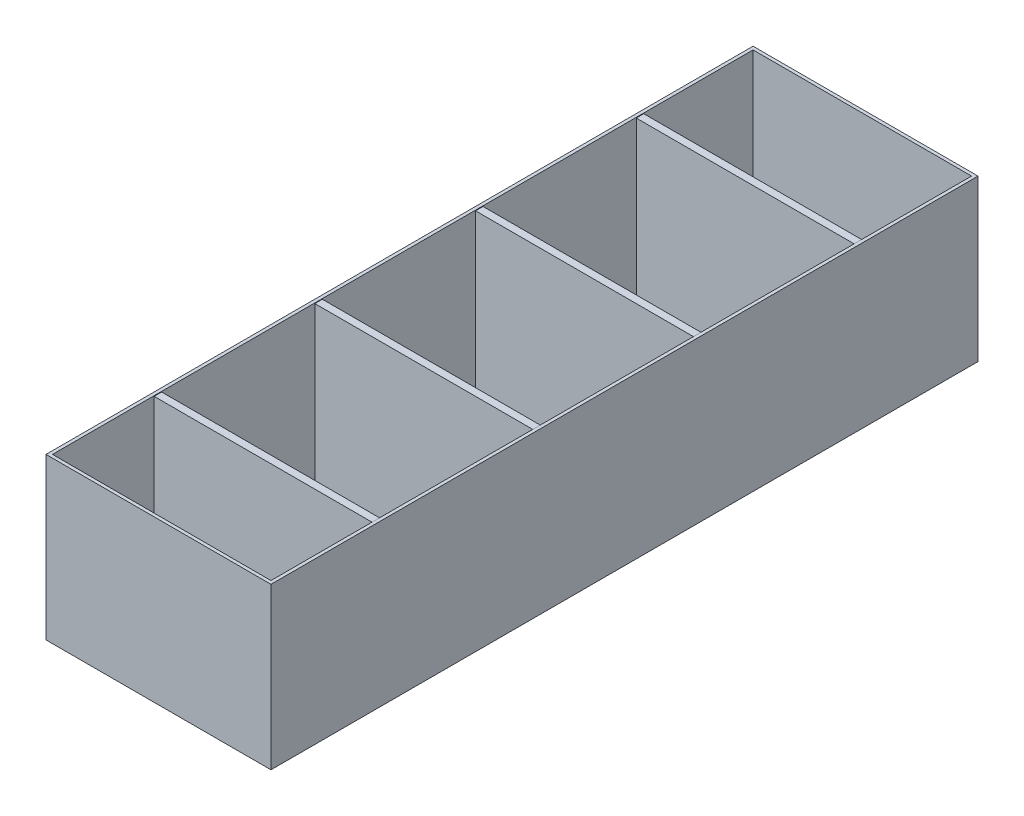
ISO-10303-21;
HEADER;
FILE_DESCRIPTION(('STEP AP214'),'2;1');
FILE_NAME('part.step','',(''),(''),'','','');
FILE_SCHEMA(('AUTOMOTIVE_DESIGN { 1 0 10303 214 1 1 1 1 }'));
ENDSEC;
DATA;
#1=APPLICATION_CONTEXT('core data for automotive mechanical design processes');
#2=APPLICATION_PROTOCOL_DEFINITION('international standard','automotive_design',2000,#1);
#3=PRODUCT_CONTEXT('',#1,'mechanical');
#4=PRODUCT('Part','Part','',(#3));
#5=PRODUCT_RELATED_PRODUCT_CATEGORY('part','',(#4));
#6=PRODUCT_DEFINITION_FORMATION('','',#4);
#7=PRODUCT_DEFINITION_CONTEXT('part definition',#1,'design');
#8=PRODUCT_DEFINITION('design','',#6,#7);
#9=PRODUCT_DEFINITION_SHAPE('','',#8);
#10=(LENGTH_UNIT() NAMED_UNIT(*) SI_UNIT(.MILLI.,.METRE.));
#11=(NAMED_UNIT(*) PLANE_ANGLE_UNIT() SI_UNIT($,.RADIAN.));
#12=(NAMED_UNIT(*) SI_UNIT($,.STERADIAN.) SOLID_ANGLE_UNIT());
#13=UNCERTAINTY_MEASURE_WITH_UNIT(LENGTH_MEASURE(1.E-05),#10,'distance_accuracy_value','');
#14=(GEOMETRIC_REPRESENTATION_CONTEXT(3) GLOBAL_UNCERTAINTY_ASSIGNED_CONTEXT((#13)) GLOBAL_UNIT_ASSIGNED_CONTEXT((#10,
#11,#12)) REPRESENTATION_CONTEXT('',''));
#15=CARTESIAN_POINT('',(0.,0.,0.));
#16=DIRECTION('',(0.,0.,1.));
#17=DIRECTION('',(1.,0.,0.));
#18=AXIS2_PLACEMENT_3D('',#15,#16,#17);
#19=CARTESIAN_POINT('',(340.,250.,2200.));
#20=DIRECTION('',(-1.,0.,0.));
#21=DIRECTION('',(0.,-1.,0.));
#22=AXIS2_PLACEMENT_3D('',#19,#20,#21);
#23=PLANE('',#22);
#24=DIRECTION('',(0.,0.,-1.));
#25=VECTOR('',#24,1.);
#26=CARTESIAN_POINT('',(340.,248.,1850.03303068523));
#27=LINE('',#26,#25);
#28=CARTESIAN_POINT('',(340.,248.,1873.35244173129));
#29=VERTEX_POINT('',#28);
#30=CARTESIAN_POINT('',(340.,248.,1850.03303068523));
#31=VERTEX_POINT('',#30);
#32=EDGE_CURVE('E207',#29,#31,#27,.T.);
#33=ORIENTED_EDGE('',*,*,#32,.F.);
#34=DIRECTION('',(0.,-1.,0.));
#35=VECTOR('',#34,1.);
#36=CARTESIAN_POINT('',(340.,248.,1873.35244173129));
#37=LINE('',#36,#35);
#38=CARTESIAN_POINT('',(340.,-240.,1873.35244173129));
#39=VERTEX_POINT('',#38);
#40=EDGE_CURVE('E204',#29,#39,#37,.T.);
#41=ORIENTED_EDGE('',*,*,#40,.T.);
#42=DIRECTION('',(0.,0.,-1.));
#43=VECTOR('',#42,1.);
#44=CARTESIAN_POINT('',(340.,-240.,2200.));
#45=LINE('',#44,#43);
#46=CARTESIAN_POINT('',(340.,-240.,2190.));
#47=VERTEX_POINT('',#46);
#48=EDGE_CURVE('E308',#47,#39,#45,.T.);
#49=ORIENTED_EDGE('',*,*,#48,.F.);
#50=DIRECTION('',(0.,1.,0.));
#51=VECTOR('',#50,1.);
#52=CARTESIAN_POINT('',(340.,250.,2190.));
#53=LINE('',#52,#51);
#54=CARTESIAN_POINT('',(340.,250.,2190.));
#55=VERTEX_POINT('',#54);
#56=EDGE_CURVE('E304',#47,#55,#53,.T.);
#57=ORIENTED_EDGE('',*,*,#56,.T.);
#58=DIRECTION('',(0.,0.,-1.));
#59=VECTOR('',#58,1.);
#60=CARTESIAN_POINT('',(340.,250.,2200.));
#61=LINE('',#60,#59);
#62=CARTESIAN_POINT('',(340.,250.,10.));
#63=VERTEX_POINT('',#62);
#64=EDGE_CURVE('E326',#55,#63,#61,.T.);
#65=ORIENTED_EDGE('',*,*,#64,.T.);
#66=DIRECTION('',(0.,1.,0.));
#67=VECTOR('',#66,1.);
#68=CARTESIAN_POINT('',(340.,250.,9.99999999999979));
#69=LINE('',#68,#67);
#70=CARTESIAN_POINT('',(340.,-240.,10.));
#71=VERTEX_POINT('',#70);
#72=EDGE_CURVE('E300',#71,#63,#69,.T.);
#73=ORIENTED_EDGE('',*,*,#72,.F.);
#74=CARTESIAN_POINT('',(340.,-240.,350.033030685231));
#75=VERTEX_POINT('',#74);
#76=EDGE_CURVE('E313',#75,#71,#45,.T.);
#77=ORIENTED_EDGE('',*,*,#76,.F.);
#78=DIRECTION('',(0.,-1.,0.));
#79=VECTOR('',#78,1.);
#80=CARTESIAN_POINT('',(340.,248.,350.033030685231));
#81=LINE('',#80,#79);
#82=CARTESIAN_POINT('',(340.,248.,350.033030685231));
#83=VERTEX_POINT('',#82);
#84=EDGE_CURVE('E292',#83,#75,#81,.T.);
#85=ORIENTED_EDGE('',*,*,#84,.F.);
#86=DIRECTION('',(0.,0.,-1.));
#87=VECTOR('',#86,1.);
#88=CARTESIAN_POINT('',(340.,248.,350.033030685231));
#89=LINE('',#88,#87);
#90=CARTESIAN_POINT('',(340.,248.,373.352441731289));
#91=VERTEX_POINT('',#90);
#92=EDGE_CURVE('E282',#91,#83,#89,.T.);
#93=ORIENTED_EDGE('',*,*,#92,.F.);
#94=DIRECTION('',(0.,-1.,0.));
#95=VECTOR('',#94,1.);
#96=CARTESIAN_POINT('',(340.,248.,373.352441731289));
#97=LINE('',#96,#95);
#98=CARTESIAN_POINT('',(340.,-240.,373.352441731289));
#99=VERTEX_POINT('',#98);
#100=EDGE_CURVE('E294',#91,#99,#97,.T.);
#101=ORIENTED_EDGE('',*,*,#100,.T.);
#102=CARTESIAN_POINT('',(340.,-240.,850.033030685231));
#103=VERTEX_POINT('',#102);
#104=EDGE_CURVE('E413',#103,#99,#45,.T.);
#105=ORIENTED_EDGE('',*,*,#104,.F.);
#106=DIRECTION('',(0.,-1.,0.));
#107=VECTOR('',#106,1.);
#108=CARTESIAN_POINT('',(340.,248.,850.033030685231));
#109=LINE('',#108,#107);
#110=CARTESIAN_POINT('',(340.,248.,850.033030685231));
#111=VERTEX_POINT('',#110);
#112=EDGE_CURVE('E267',#111,#103,#109,.T.);
#113=ORIENTED_EDGE('',*,*,#112,.F.);
#114=DIRECTION('',(0.,0.,-1.));
#115=VECTOR('',#114,1.);
#116=CARTESIAN_POINT('',(340.,248.,850.033030685231));
#117=LINE('',#116,#115);
#118=CARTESIAN_POINT('',(340.,248.,873.352441731289));
#119=VERTEX_POINT('',#118);
#120=EDGE_CURVE('E257',#119,#111,#117,.T.);
#121=ORIENTED_EDGE('',*,*,#120,.F.);
#122=DIRECTION('',(0.,-1.,0.));
#123=VECTOR('',#122,1.);
#124=CARTESIAN_POINT('',(340.,248.,873.352441731289));
#125=LINE('',#124,#123);
#126=CARTESIAN_POINT('',(340.,-240.,873.352441731289));
#127=VERTEX_POINT('',#126);
#128=EDGE_CURVE('E269',#119,#127,#125,.T.);
#129=ORIENTED_EDGE('',*,*,#128,.T.);
#130=CARTESIAN_POINT('',(340.,-240.,1350.03303068523));
#131=VERTEX_POINT('',#130);
#132=EDGE_CURVE('E412',#131,#127,#45,.T.);
#133=ORIENTED_EDGE('',*,*,#132,.F.);
#134=DIRECTION('',(0.,-1.,0.));
#135=VECTOR('',#134,1.);
#136=CARTESIAN_POINT('',(340.,248.,1350.03303068523));
#137=LINE('',#136,#135);
#138=CARTESIAN_POINT('',(340.,248.,1350.03303068523));
#139=VERTEX_POINT('',#138);
#140=EDGE_CURVE('E58',#139,#131,#137,.T.);
#141=ORIENTED_EDGE('',*,*,#140,.F.);
#142=DIRECTION('',(0.,0.,-1.));
#143=VECTOR('',#142,1.);
#144=CARTESIAN_POINT('',(340.,248.,1350.03303068523));
#145=LINE('',#144,#143);
#146=CARTESIAN_POINT('',(340.,248.,1373.35244173129));
#147=VERTEX_POINT('',#146);
#148=EDGE_CURVE('E235',#147,#139,#145,.T.);
#149=ORIENTED_EDGE('',*,*,#148,.F.);
#150=DIRECTION('',(0.,-1.,0.));
#151=VECTOR('',#150,1.);
#152=CARTESIAN_POINT('',(340.,248.,1373.35244173129));
#153=LINE('',#152,#151);
#154=CARTESIAN_POINT('',(340.,-240.,1373.35244173129));
#155=VERTEX_POINT('',#154);
#156=EDGE_CURVE('E244',#147,#155,#153,.T.);
#157=ORIENTED_EDGE('',*,*,#156,.T.);
#158=CARTESIAN_POINT('',(340.,-240.,1850.03303068523));
#159=VERTEX_POINT('',#158);
#160=EDGE_CURVE('E312',#159,#155,#45,.T.);
#161=ORIENTED_EDGE('',*,*,#160,.F.);
#162=DIRECTION('',(0.,-1.,0.));
#163=VECTOR('',#162,1.);
#164=CARTESIAN_POINT('',(340.,248.,1850.03303068523));
#165=LINE('',#164,#163);
#166=EDGE_CURVE('E50',#31,#159,#165,.T.);
#167=ORIENTED_EDGE('',*,*,#166,.F.);
#168=EDGE_LOOP('',(#33,#41,#49,#57,#65,#73,#77,#85,#93,#101,#105,#113,#121,#129,#133,#141,#149,
#157,#161,#167));
#169=FACE_BOUND('',#168,.T.);
#170=ADVANCED_FACE('F35',(#169),#23,.T.);
#171=CARTESIAN_POINT('',(-340.,250.,2200.));
#172=DIRECTION('',(1.,0.,0.));
#173=DIRECTION('',(0.,1.,0.));
#174=AXIS2_PLACEMENT_3D('',#171,#172,#173);
#175=PLANE('',#174);
#176=DIRECTION('',(0.,0.,-1.));
#177=VECTOR('',#176,1.);
#178=CARTESIAN_POINT('',(-340.,-240.,2200.));
#179=LINE('',#178,#177);
#180=CARTESIAN_POINT('',(-340.,-240.,2190.));
#181=VERTEX_POINT('',#180);
#182=CARTESIAN_POINT('',(-340.,-240.,1873.35244173129));
#183=VERTEX_POINT('',#182);
#184=EDGE_CURVE('E221',#181,#183,#179,.T.);
#185=ORIENTED_EDGE('',*,*,#184,.T.);
#186=DIRECTION('',(0.,-1.,0.));
#187=VECTOR('',#186,1.);
#188=CARTESIAN_POINT('',(-340.,248.,1873.35244173129));
#189=LINE('',#188,#187);
#190=CARTESIAN_POINT('',(-340.,248.,1873.35244173129));
#191=VERTEX_POINT('',#190);
#192=EDGE_CURVE('E201',#191,#183,#189,.T.);
#193=ORIENTED_EDGE('',*,*,#192,.F.);
#194=DIRECTION('',(0.,0.,1.));
#195=VECTOR('',#194,1.);
#196=CARTESIAN_POINT('',(-340.,248.,1873.35244173129));
#197=LINE('',#196,#195);
#198=CARTESIAN_POINT('',(-340.,248.,1850.03303068523));
#199=VERTEX_POINT('',#198);
#200=EDGE_CURVE('E208',#199,#191,#197,.T.);
#201=ORIENTED_EDGE('',*,*,#200,.F.);
#202=DIRECTION('',(0.,-1.,0.));
#203=VECTOR('',#202,1.);
#204=CARTESIAN_POINT('',(-340.,248.,1850.03303068523));
#205=LINE('',#204,#203);
#206=CARTESIAN_POINT('',(-340.,-240.,1850.03303068523));
#207=VERTEX_POINT('',#206);
#208=EDGE_CURVE('E403',#199,#207,#205,.T.);
#209=ORIENTED_EDGE('',*,*,#208,.T.);
#210=CARTESIAN_POINT('',(-340.,-240.,1373.35244173129));
#211=VERTEX_POINT('',#210);
#212=EDGE_CURVE('E322',#207,#211,#179,.T.);
#213=ORIENTED_EDGE('',*,*,#212,.T.);
#214=DIRECTION('',(0.,-1.,0.));
#215=VECTOR('',#214,1.);
#216=CARTESIAN_POINT('',(-340.,248.,1373.35244173129));
#217=LINE('',#216,#215);
#218=CARTESIAN_POINT('',(-340.,248.,1373.35244173129));
#219=VERTEX_POINT('',#218);
#220=EDGE_CURVE('E247',#219,#211,#217,.T.);
#221=ORIENTED_EDGE('',*,*,#220,.F.);
#222=DIRECTION('',(0.,0.,1.));
#223=VECTOR('',#222,1.);
#224=CARTESIAN_POINT('',(-340.,248.,1373.35244173129));
#225=LINE('',#224,#223);
#226=CARTESIAN_POINT('',(-340.,248.,1350.03303068523));
#227=VERTEX_POINT('',#226);
#228=EDGE_CURVE('E230',#227,#219,#225,.T.);
#229=ORIENTED_EDGE('',*,*,#228,.F.);
#230=DIRECTION('',(0.,-1.,0.));
#231=VECTOR('',#230,1.);
#232=CARTESIAN_POINT('',(-340.,248.,1350.03303068523));
#233=LINE('',#232,#231);
#234=CARTESIAN_POINT('',(-340.,-240.,1350.03303068523));
#235=VERTEX_POINT('',#234);
#236=EDGE_CURVE('E238',#227,#235,#233,.T.);
#237=ORIENTED_EDGE('',*,*,#236,.T.);
#238=CARTESIAN_POINT('',(-340.,-240.,873.352441731289));
#239=VERTEX_POINT('',#238);
#240=EDGE_CURVE('E395',#235,#239,#179,.T.);
#241=ORIENTED_EDGE('',*,*,#240,.T.);
#242=DIRECTION('',(0.,-1.,0.));
#243=VECTOR('',#242,1.);
#244=CARTESIAN_POINT('',(-340.,248.,873.352441731289));
#245=LINE('',#244,#243);
#246=CARTESIAN_POINT('',(-340.,248.,873.352441731289));
#247=VERTEX_POINT('',#246);
#248=EDGE_CURVE('E272',#247,#239,#245,.T.);
#249=ORIENTED_EDGE('',*,*,#248,.F.);
#250=DIRECTION('',(0.,0.,1.));
#251=VECTOR('',#250,1.);
#252=CARTESIAN_POINT('',(-340.,248.,873.352441731289));
#253=LINE('',#252,#251);
#254=CARTESIAN_POINT('',(-340.,248.,850.033030685231));
#255=VERTEX_POINT('',#254);
#256=EDGE_CURVE('E251',#255,#247,#253,.T.);
#257=ORIENTED_EDGE('',*,*,#256,.F.);
#258=DIRECTION('',(0.,-1.,0.));
#259=VECTOR('',#258,1.);
#260=CARTESIAN_POINT('',(-340.,248.,850.033030685231));
#261=LINE('',#260,#259);
#262=CARTESIAN_POINT('',(-340.,-240.,850.033030685231));
#263=VERTEX_POINT('',#262);
#264=EDGE_CURVE('E261',#255,#263,#261,.T.);
#265=ORIENTED_EDGE('',*,*,#264,.T.);
#266=CARTESIAN_POINT('',(-340.,-240.,373.352441731289));
#267=VERTEX_POINT('',#266);
#268=EDGE_CURVE('E394',#263,#267,#179,.T.);
#269=ORIENTED_EDGE('',*,*,#268,.T.);
#270=DIRECTION('',(0.,-1.,0.));
#271=VECTOR('',#270,1.);
#272=CARTESIAN_POINT('',(-340.,248.,373.352441731289));
#273=LINE('',#272,#271);
#274=CARTESIAN_POINT('',(-340.,248.,373.352441731289));
#275=VERTEX_POINT('',#274);
#276=EDGE_CURVE('E297',#275,#267,#273,.T.);
#277=ORIENTED_EDGE('',*,*,#276,.F.);
#278=DIRECTION('',(0.,0.,1.));
#279=VECTOR('',#278,1.);
#280=CARTESIAN_POINT('',(-340.,248.,373.352441731289));
#281=LINE('',#280,#279);
#282=CARTESIAN_POINT('',(-340.,248.,350.033030685231));
#283=VERTEX_POINT('',#282);
#284=EDGE_CURVE('E276',#283,#275,#281,.T.);
#285=ORIENTED_EDGE('',*,*,#284,.F.);
#286=DIRECTION('',(0.,-1.,0.));
#287=VECTOR('',#286,1.);
#288=CARTESIAN_POINT('',(-340.,248.,350.033030685231));
#289=LINE('',#288,#287);
#290=CARTESIAN_POINT('',(-340.,-240.,350.033030685231));
#291=VERTEX_POINT('',#290);
#292=EDGE_CURVE('E286',#283,#291,#289,.T.);
#293=ORIENTED_EDGE('',*,*,#292,.T.);
#294=CARTESIAN_POINT('',(-340.,-240.,10.));
#295=VERTEX_POINT('',#294);
#296=EDGE_CURVE('E311',#291,#295,#179,.T.);
#297=ORIENTED_EDGE('',*,*,#296,.T.);
#298=DIRECTION('',(0.,-1.,0.));
#299=VECTOR('',#298,1.);
#300=CARTESIAN_POINT('',(-340.,250.,9.99999999999979));
#301=LINE('',#300,#299);
#302=CARTESIAN_POINT('',(-340.,250.,10.));
#303=VERTEX_POINT('',#302);
#304=EDGE_CURVE('E316',#303,#295,#301,.T.);
#305=ORIENTED_EDGE('',*,*,#304,.F.);
#306=DIRECTION('',(0.,0.,-1.));
#307=VECTOR('',#306,1.);
#308=CARTESIAN_POINT('',(-340.,250.,2200.));
#309=LINE('',#308,#307);
#310=CARTESIAN_POINT('',(-340.,250.,2190.));
#311=VERTEX_POINT('',#310);
#312=EDGE_CURVE('E321',#311,#303,#309,.T.);
#313=ORIENTED_EDGE('',*,*,#312,.F.);
#314=DIRECTION('',(0.,-1.,0.));
#315=VECTOR('',#314,1.);
#316=CARTESIAN_POINT('',(-340.,250.,2190.));
#317=LINE('',#316,#315);
#318=EDGE_CURVE('E319',#311,#181,#317,.T.);
#319=ORIENTED_EDGE('',*,*,#318,.T.);
#320=EDGE_LOOP('',(#185,#193,#201,#209,#213,#221,#229,#237,#241,#249,#257,#265,#269,#277,#285,
#293,#297,#305,#313,#319));
#321=FACE_BOUND('',#320,.T.);
#322=ADVANCED_FACE('F219',(#321),#175,.T.);
#323=CARTESIAN_POINT('',(-350.,-240.,2200.));
#324=DIRECTION('',(0.,1.,0.));
#325=DIRECTION('',(0.,0.,1.));
#326=AXIS2_PLACEMENT_3D('',#323,#324,#325);
#327=PLANE('',#326);
#328=ORIENTED_EDGE('',*,*,#48,.T.);
#329=DIRECTION('',(1.,0.,0.));
#330=VECTOR('',#329,1.);
#331=CARTESIAN_POINT('',(340.,-240.,1873.35244173129));
#332=LINE('',#331,#330);
#333=EDGE_CURVE('E431',#183,#39,#332,.T.);
#334=ORIENTED_EDGE('',*,*,#333,.F.);
#335=ORIENTED_EDGE('',*,*,#184,.F.);
#336=DIRECTION('',(1.,0.,0.));
#337=VECTOR('',#336,1.);
#338=CARTESIAN_POINT('',(-350.,-240.,2190.));
#339=LINE('',#338,#337);
#340=EDGE_CURVE('E317',#181,#47,#339,.T.);
#341=ORIENTED_EDGE('',*,*,#340,.T.);
#342=EDGE_LOOP('',(#328,#334,#335,#341));
#343=FACE_BOUND('',#342,.T.);
#344=ADVANCED_FACE('F430',(#343),#327,.T.);
#345=ORIENTED_EDGE('',*,*,#212,.F.);
#346=DIRECTION('',(-1.,0.,0.));
#347=VECTOR('',#346,1.);
#348=CARTESIAN_POINT('',(-340.,-240.,1850.03303068523));
#349=LINE('',#348,#347);
#350=EDGE_CURVE('E216',#159,#207,#349,.T.);
#351=ORIENTED_EDGE('',*,*,#350,.F.);
#352=ORIENTED_EDGE('',*,*,#160,.T.);
#353=DIRECTION('',(1.,0.,0.));
#354=VECTOR('',#353,1.);
#355=CARTESIAN_POINT('',(340.,-240.,1373.35244173129));
#356=LINE('',#355,#354);
#357=EDGE_CURVE('E222',#211,#155,#356,.T.);
#358=ORIENTED_EDGE('',*,*,#357,.F.);
#359=EDGE_LOOP('',(#345,#351,#352,#358));
#360=FACE_BOUND('',#359,.T.);
#361=ADVANCED_FACE('F409',(#360),#327,.T.);
#362=ORIENTED_EDGE('',*,*,#240,.F.);
#363=DIRECTION('',(-1.,0.,0.));
#364=VECTOR('',#363,1.);
#365=CARTESIAN_POINT('',(-340.,-240.,1350.03303068523));
#366=LINE('',#365,#364);
#367=EDGE_CURVE('E225',#131,#235,#366,.T.);
#368=ORIENTED_EDGE('',*,*,#367,.F.);
#369=ORIENTED_EDGE('',*,*,#132,.T.);
#370=DIRECTION('',(1.,0.,0.));
#371=VECTOR('',#370,1.);
#372=CARTESIAN_POINT('',(340.,-240.,873.352441731289));
#373=LINE('',#372,#371);
#374=EDGE_CURVE('E250',#239,#127,#373,.T.);
#375=ORIENTED_EDGE('',*,*,#374,.F.);
#376=EDGE_LOOP('',(#362,#368,#369,#375));
#377=FACE_BOUND('',#376,.T.);
#378=ADVANCED_FACE('F495',(#377),#327,.T.);
#379=ORIENTED_EDGE('',*,*,#268,.F.);
#380=DIRECTION('',(-1.,0.,0.));
#381=VECTOR('',#380,1.);
#382=CARTESIAN_POINT('',(-340.,-240.,850.033030685231));
#383=LINE('',#382,#381);
#384=EDGE_CURVE('E255',#103,#263,#383,.T.);
#385=ORIENTED_EDGE('',*,*,#384,.F.);
#386=ORIENTED_EDGE('',*,*,#104,.T.);
#387=DIRECTION('',(1.,0.,0.));
#388=VECTOR('',#387,1.);
#389=CARTESIAN_POINT('',(340.,-240.,373.352441731289));
#390=LINE('',#389,#388);
#391=EDGE_CURVE('E275',#267,#99,#390,.T.);
#392=ORIENTED_EDGE('',*,*,#391,.F.);
#393=EDGE_LOOP('',(#379,#385,#386,#392));
#394=FACE_BOUND('',#393,.T.);
#395=ADVANCED_FACE('F487',(#394),#327,.T.);
#396=ORIENTED_EDGE('',*,*,#296,.F.);
#397=DIRECTION('',(-1.,0.,0.));
#398=VECTOR('',#397,1.);
#399=CARTESIAN_POINT('',(-340.,-240.,350.033030685231));
#400=LINE('',#399,#398);
#401=EDGE_CURVE('E280',#75,#291,#400,.T.);
#402=ORIENTED_EDGE('',*,*,#401,.F.);
#403=ORIENTED_EDGE('',*,*,#76,.T.);
#404=DIRECTION('',(1.,0.,0.));
#405=VECTOR('',#404,1.);
#406=CARTESIAN_POINT('',(-350.,-240.,9.99999999999979));
#407=LINE('',#406,#405);
#408=EDGE_CURVE('E307',#295,#71,#407,.T.);
#409=ORIENTED_EDGE('',*,*,#408,.F.);
#410=EDGE_LOOP('',(#396,#402,#403,#409));
#411=FACE_BOUND('',#410,.T.);
#412=ADVANCED_FACE('F380',(#411),#327,.T.);
#413=CARTESIAN_POINT('',(-350.,250.,2200.));
#414=DIRECTION('',(0.,-1.,0.));
#415=DIRECTION('',(0.,0.,-1.));
#416=AXIS2_PLACEMENT_3D('',#413,#414,#415);
#417=PLANE('',#416);
#418=DIRECTION('',(-1.,0.,0.));
#419=VECTOR('',#418,1.);
#420=CARTESIAN_POINT('',(-350.,250.,0.));
#421=LINE('',#420,#419);
#422=CARTESIAN_POINT('',(350.,250.,0.));
#423=VERTEX_POINT('',#422);
#424=CARTESIAN_POINT('',(-350.,250.,0.));
#425=VERTEX_POINT('',#424);
#426=EDGE_CURVE('E347',#423,#425,#421,.T.);
#427=ORIENTED_EDGE('',*,*,#426,.T.);
#428=DIRECTION('',(0.,0.,-1.));
#429=VECTOR('',#428,1.);
#430=CARTESIAN_POINT('',(-350.,250.,2200.));
#431=LINE('',#430,#429);
#432=CARTESIAN_POINT('',(-350.,250.,2200.));
#433=VERTEX_POINT('',#432);
#434=EDGE_CURVE('E43',#433,#425,#431,.T.);
#435=ORIENTED_EDGE('',*,*,#434,.F.);
#436=DIRECTION('',(-1.,0.,0.));
#437=VECTOR('',#436,1.);
#438=CARTESIAN_POINT('',(-350.,250.,2200.));
#439=LINE('',#438,#437);
#440=CARTESIAN_POINT('',(350.,250.,2200.));
#441=VERTEX_POINT('',#440);
#442=EDGE_CURVE('E337',#441,#433,#439,.T.);
#443=ORIENTED_EDGE('',*,*,#442,.F.);
#444=DIRECTION('',(0.,0.,-1.));
#445=VECTOR('',#444,1.);
#446=CARTESIAN_POINT('',(350.,250.,2200.));
#447=LINE('',#446,#445);
#448=EDGE_CURVE('E11',#441,#423,#447,.T.);
#449=ORIENTED_EDGE('',*,*,#448,.T.);
#450=EDGE_LOOP('',(#427,#435,#443,#449));
#451=FACE_BOUND('',#450,.T.);
#452=DIRECTION('',(-1.,0.,0.));
#453=VECTOR('',#452,1.);
#454=CARTESIAN_POINT('',(-350.,250.,9.99999999999979));
#455=LINE('',#454,#453);
#456=EDGE_CURVE('E303',#63,#303,#455,.T.);
#457=ORIENTED_EDGE('',*,*,#456,.F.);
#458=ORIENTED_EDGE('',*,*,#64,.F.);
#459=DIRECTION('',(-1.,0.,0.));
#460=VECTOR('',#459,1.);
#461=CARTESIAN_POINT('',(-350.,250.,2190.));
#462=LINE('',#461,#460);
#463=EDGE_CURVE('E306',#55,#311,#462,.T.);
#464=ORIENTED_EDGE('',*,*,#463,.T.);
#465=ORIENTED_EDGE('',*,*,#312,.T.);
#466=EDGE_LOOP('',(#457,#458,#464,#465));
#467=FACE_BOUND('',#466,.T.);
#468=ADVANCED_FACE('F377',(#451,#467),#417,.F.);
#469=CARTESIAN_POINT('',(350.,250.,2200.));
#470=DIRECTION('',(-1.,0.,0.));
#471=DIRECTION('',(0.,-1.,0.));
#472=AXIS2_PLACEMENT_3D('',#469,#470,#471);
#473=PLANE('',#472);
#474=DIRECTION('',(0.,1.,0.));
#475=VECTOR('',#474,1.);
#476=CARTESIAN_POINT('',(350.,250.,0.));
#477=LINE('',#476,#475);
#478=CARTESIAN_POINT('',(350.,-250.,0.));
#479=VERTEX_POINT('',#478);
#480=EDGE_CURVE('E328',#479,#423,#477,.T.);
#481=ORIENTED_EDGE('',*,*,#480,.T.);
#482=ORIENTED_EDGE('',*,*,#448,.F.);
#483=DIRECTION('',(0.,1.,0.));
#484=VECTOR('',#483,1.);
#485=CARTESIAN_POINT('',(350.,250.,2200.));
#486=LINE('',#485,#484);
#487=CARTESIAN_POINT('',(350.,-250.,2200.));
#488=VERTEX_POINT('',#487);
#489=EDGE_CURVE('E334',#488,#441,#486,.T.);
#490=ORIENTED_EDGE('',*,*,#489,.F.);
#491=DIRECTION('',(0.,0.,-1.));
#492=VECTOR('',#491,1.);
#493=CARTESIAN_POINT('',(350.,-250.,2200.));
#494=LINE('',#493,#492);
#495=EDGE_CURVE('E344',#488,#479,#494,.T.);
#496=ORIENTED_EDGE('',*,*,#495,.T.);
#497=EDGE_LOOP('',(#481,#482,#490,#496));
#498=FACE_BOUND('',#497,.T.);
#499=ADVANCED_FACE('F37',(#498),#473,.F.);
#500=CARTESIAN_POINT('',(-350.,250.,2200.));
#501=DIRECTION('',(1.,0.,0.));
#502=DIRECTION('',(0.,1.,0.));
#503=AXIS2_PLACEMENT_3D('',#500,#501,#502);
#504=PLANE('',#503);
#505=DIRECTION('',(0.,-1.,0.));
#506=VECTOR('',#505,1.);
#507=CARTESIAN_POINT('',(-350.,250.,0.));
#508=LINE('',#507,#506);
#509=CARTESIAN_POINT('',(-350.,-250.,0.));
#510=VERTEX_POINT('',#509);
#511=EDGE_CURVE('E349',#425,#510,#508,.T.);
#512=ORIENTED_EDGE('',*,*,#511,.T.);
#513=DIRECTION('',(0.,0.,-1.));
#514=VECTOR('',#513,1.);
#515=CARTESIAN_POINT('',(-350.,-250.,2200.));
#516=LINE('',#515,#514);
#517=CARTESIAN_POINT('',(-350.,-250.,2200.));
#518=VERTEX_POINT('',#517);
#519=EDGE_CURVE('E354',#518,#510,#516,.T.);
#520=ORIENTED_EDGE('',*,*,#519,.F.);
#521=DIRECTION('',(0.,-1.,0.));
#522=VECTOR('',#521,1.);
#523=CARTESIAN_POINT('',(-350.,250.,2200.));
#524=LINE('',#523,#522);
#525=EDGE_CURVE('E340',#433,#518,#524,.T.);
#526=ORIENTED_EDGE('',*,*,#525,.F.);
#527=ORIENTED_EDGE('',*,*,#434,.T.);
#528=EDGE_LOOP('',(#512,#520,#526,#527));
#529=FACE_BOUND('',#528,.T.);
#530=ADVANCED_FACE('F361',(#529),#504,.F.);
#531=CARTESIAN_POINT('',(-350.,-250.,2200.));
#532=DIRECTION('',(0.,1.,0.));
#533=DIRECTION('',(0.,0.,1.));
#534=AXIS2_PLACEMENT_3D('',#531,#532,#533);
#535=PLANE('',#534);
#536=DIRECTION('',(1.,0.,0.));
#537=VECTOR('',#536,1.);
#538=CARTESIAN_POINT('',(-350.,-250.,0.));
#539=LINE('',#538,#537);
#540=EDGE_CURVE('E338',#510,#479,#539,.T.);
#541=ORIENTED_EDGE('',*,*,#540,.T.);
#542=ORIENTED_EDGE('',*,*,#495,.F.);
#543=DIRECTION('',(1.,0.,0.));
#544=VECTOR('',#543,1.);
#545=CARTESIAN_POINT('',(-350.,-250.,2200.));
#546=LINE('',#545,#544);
#547=EDGE_CURVE('E342',#518,#488,#546,.T.);
#548=ORIENTED_EDGE('',*,*,#547,.F.);
#549=ORIENTED_EDGE('',*,*,#519,.T.);
#550=EDGE_LOOP('',(#541,#542,#548,#549));
#551=FACE_BOUND('',#550,.T.);
#552=ADVANCED_FACE('F370',(#551),#535,.F.);
#553=CARTESIAN_POINT('',(0.,0.,2200.));
#554=DIRECTION('',(0.,0.,1.));
#555=DIRECTION('',(1.,0.,0.));
#556=AXIS2_PLACEMENT_3D('',#553,#554,#555);
#557=PLANE('',#556);
#558=ORIENTED_EDGE('',*,*,#489,.T.);
#559=ORIENTED_EDGE('',*,*,#442,.T.);
#560=ORIENTED_EDGE('',*,*,#525,.T.);
#561=ORIENTED_EDGE('',*,*,#547,.T.);
#562=EDGE_LOOP('',(#558,#559,#560,#561));
#563=FACE_BOUND('',#562,.T.);
#564=ADVANCED_FACE('F376',(#563),#557,.T.);
#565=CARTESIAN_POINT('',(0.,0.,0.));
#566=DIRECTION('',(0.,0.,1.));
#567=DIRECTION('',(1.,0.,0.));
#568=AXIS2_PLACEMENT_3D('',#565,#566,#567);
#569=PLANE('',#568);
#570=ORIENTED_EDGE('',*,*,#480,.F.);
#571=ORIENTED_EDGE('',*,*,#540,.F.);
#572=ORIENTED_EDGE('',*,*,#511,.F.);
#573=ORIENTED_EDGE('',*,*,#426,.F.);
#574=EDGE_LOOP('',(#570,#571,#572,#573));
#575=FACE_BOUND('',#574,.T.);
#576=ADVANCED_FACE('F367',(#575),#569,.F.);
#577=CARTESIAN_POINT('',(0.,0.,2190.));
#578=DIRECTION('',(0.,0.,1.));
#579=DIRECTION('',(1.,0.,0.));
#580=AXIS2_PLACEMENT_3D('',#577,#578,#579);
#581=PLANE('',#580);
#582=ORIENTED_EDGE('',*,*,#56,.F.);
#583=ORIENTED_EDGE('',*,*,#340,.F.);
#584=ORIENTED_EDGE('',*,*,#318,.F.);
#585=ORIENTED_EDGE('',*,*,#463,.F.);
#586=EDGE_LOOP('',(#582,#583,#584,#585));
#587=FACE_BOUND('',#586,.T.);
#588=ADVANCED_FACE('F428',(#587),#581,.F.);
#589=CARTESIAN_POINT('',(0.,0.,10.));
#590=DIRECTION('',(0.,0.,1.));
#591=DIRECTION('',(1.,0.,0.));
#592=AXIS2_PLACEMENT_3D('',#589,#590,#591);
#593=PLANE('',#592);
#594=ORIENTED_EDGE('',*,*,#72,.T.);
#595=ORIENTED_EDGE('',*,*,#456,.T.);
#596=ORIENTED_EDGE('',*,*,#304,.T.);
#597=ORIENTED_EDGE('',*,*,#408,.T.);
#598=EDGE_LOOP('',(#594,#595,#596,#597));
#599=FACE_BOUND('',#598,.T.);
#600=ADVANCED_FACE('F385',(#599),#593,.T.);
#601=CARTESIAN_POINT('',(340.,248.,373.352441731289));
#602=DIRECTION('',(0.,0.,-1.));
#603=DIRECTION('',(-1.,0.,0.));
#604=AXIS2_PLACEMENT_3D('',#601,#602,#603);
#605=PLANE('',#604);
#606=ORIENTED_EDGE('',*,*,#391,.T.);
#607=ORIENTED_EDGE('',*,*,#100,.F.);
#608=DIRECTION('',(1.,0.,0.));
#609=VECTOR('',#608,1.);
#610=CARTESIAN_POINT('',(340.,248.,373.352441731289));
#611=LINE('',#610,#609);
#612=EDGE_CURVE('E279',#275,#91,#611,.T.);
#613=ORIENTED_EDGE('',*,*,#612,.F.);
#614=ORIENTED_EDGE('',*,*,#276,.T.);
#615=EDGE_LOOP('',(#606,#607,#613,#614));
#616=FACE_BOUND('',#615,.T.);
#617=ADVANCED_FACE('F454',(#616),#605,.F.);
#618=CARTESIAN_POINT('',(-340.,248.,350.033030685231));
#619=DIRECTION('',(0.,0.,1.));
#620=DIRECTION('',(1.,0.,0.));
#621=AXIS2_PLACEMENT_3D('',#618,#619,#620);
#622=PLANE('',#621);
#623=ORIENTED_EDGE('',*,*,#401,.T.);
#624=ORIENTED_EDGE('',*,*,#292,.F.);
#625=DIRECTION('',(-1.,0.,0.));
#626=VECTOR('',#625,1.);
#627=CARTESIAN_POINT('',(-340.,248.,350.033030685231));
#628=LINE('',#627,#626);
#629=EDGE_CURVE('E284',#83,#283,#628,.T.);
#630=ORIENTED_EDGE('',*,*,#629,.F.);
#631=ORIENTED_EDGE('',*,*,#84,.T.);
#632=EDGE_LOOP('',(#623,#624,#630,#631));
#633=FACE_BOUND('',#632,.T.);
#634=ADVANCED_FACE('F530',(#633),#622,.F.);
#635=CARTESIAN_POINT('',(0.,248.,0.));
#636=DIRECTION('',(0.,-1.,0.));
#637=DIRECTION('',(0.,0.,-1.));
#638=AXIS2_PLACEMENT_3D('',#635,#636,#637);
#639=PLANE('',#638);
#640=ORIENTED_EDGE('',*,*,#284,.T.);
#641=ORIENTED_EDGE('',*,*,#612,.T.);
#642=ORIENTED_EDGE('',*,*,#92,.T.);
#643=ORIENTED_EDGE('',*,*,#629,.T.);
#644=EDGE_LOOP('',(#640,#641,#642,#643));
#645=FACE_BOUND('',#644,.T.);
#646=ADVANCED_FACE('F524',(#645),#639,.F.);
#647=CARTESIAN_POINT('',(340.,248.,873.352441731289));
#648=DIRECTION('',(0.,0.,-1.));
#649=DIRECTION('',(-1.,0.,0.));
#650=AXIS2_PLACEMENT_3D('',#647,#648,#649);
#651=PLANE('',#650);
#652=ORIENTED_EDGE('',*,*,#374,.T.);
#653=ORIENTED_EDGE('',*,*,#128,.F.);
#654=DIRECTION('',(1.,0.,0.));
#655=VECTOR('',#654,1.);
#656=CARTESIAN_POINT('',(340.,248.,873.352441731289));
#657=LINE('',#656,#655);
#658=EDGE_CURVE('E254',#247,#119,#657,.T.);
#659=ORIENTED_EDGE('',*,*,#658,.F.);
#660=ORIENTED_EDGE('',*,*,#248,.T.);
#661=EDGE_LOOP('',(#652,#653,#659,#660));
#662=FACE_BOUND('',#661,.T.);
#663=ADVANCED_FACE('F529',(#662),#651,.F.);
#664=CARTESIAN_POINT('',(-340.,248.,850.033030685231));
#665=DIRECTION('',(0.,0.,1.));
#666=DIRECTION('',(1.,0.,0.));
#667=AXIS2_PLACEMENT_3D('',#664,#665,#666);
#668=PLANE('',#667);
#669=ORIENTED_EDGE('',*,*,#384,.T.);
#670=ORIENTED_EDGE('',*,*,#264,.F.);
#671=DIRECTION('',(-1.,0.,0.));
#672=VECTOR('',#671,1.);
#673=CARTESIAN_POINT('',(-340.,248.,850.033030685231));
#674=LINE('',#673,#672);
#675=EDGE_CURVE('E259',#111,#255,#674,.T.);
#676=ORIENTED_EDGE('',*,*,#675,.F.);
#677=ORIENTED_EDGE('',*,*,#112,.T.);
#678=EDGE_LOOP('',(#669,#670,#676,#677));
#679=FACE_BOUND('',#678,.T.);
#680=ADVANCED_FACE('F597',(#679),#668,.F.);
#681=CARTESIAN_POINT('',(0.,248.,500.));
#682=DIRECTION('',(0.,-1.,0.));
#683=DIRECTION('',(0.,0.,-1.));
#684=AXIS2_PLACEMENT_3D('',#681,#682,#683);
#685=PLANE('',#684);
#686=ORIENTED_EDGE('',*,*,#256,.T.);
#687=ORIENTED_EDGE('',*,*,#658,.T.);
#688=ORIENTED_EDGE('',*,*,#120,.T.);
#689=ORIENTED_EDGE('',*,*,#675,.T.);
#690=EDGE_LOOP('',(#686,#687,#688,#689));
#691=FACE_BOUND('',#690,.T.);
#692=ADVANCED_FACE('F601',(#691),#685,.F.);
#693=CARTESIAN_POINT('',(340.,248.,1373.35244173129));
#694=DIRECTION('',(0.,0.,-1.));
#695=DIRECTION('',(-1.,0.,0.));
#696=AXIS2_PLACEMENT_3D('',#693,#694,#695);
#697=PLANE('',#696);
#698=ORIENTED_EDGE('',*,*,#357,.T.);
#699=ORIENTED_EDGE('',*,*,#156,.F.);
#700=DIRECTION('',(1.,0.,0.));
#701=VECTOR('',#700,1.);
#702=CARTESIAN_POINT('',(340.,248.,1373.35244173129));
#703=LINE('',#702,#701);
#704=EDGE_CURVE('E233',#219,#147,#703,.T.);
#705=ORIENTED_EDGE('',*,*,#704,.F.);
#706=ORIENTED_EDGE('',*,*,#220,.T.);
#707=EDGE_LOOP('',(#698,#699,#705,#706));
#708=FACE_BOUND('',#707,.T.);
#709=ADVANCED_FACE('F407',(#708),#697,.F.);
#710=CARTESIAN_POINT('',(-340.,248.,1350.03303068523));
#711=DIRECTION('',(0.,0.,1.));
#712=DIRECTION('',(1.,0.,0.));
#713=AXIS2_PLACEMENT_3D('',#710,#711,#712);
#714=PLANE('',#713);
#715=ORIENTED_EDGE('',*,*,#367,.T.);
#716=ORIENTED_EDGE('',*,*,#236,.F.);
#717=DIRECTION('',(-1.,0.,0.));
#718=VECTOR('',#717,1.);
#719=CARTESIAN_POINT('',(-340.,248.,1350.03303068523));
#720=LINE('',#719,#718);
#721=EDGE_CURVE('E237',#139,#227,#720,.T.);
#722=ORIENTED_EDGE('',*,*,#721,.F.);
#723=ORIENTED_EDGE('',*,*,#140,.T.);
#724=EDGE_LOOP('',(#715,#716,#722,#723));
#725=FACE_BOUND('',#724,.T.);
#726=ADVANCED_FACE('F607',(#725),#714,.F.);
#727=CARTESIAN_POINT('',(0.,248.,1000.));
#728=DIRECTION('',(0.,-1.,0.));
#729=DIRECTION('',(0.,0.,-1.));
#730=AXIS2_PLACEMENT_3D('',#727,#728,#729);
#731=PLANE('',#730);
#732=ORIENTED_EDGE('',*,*,#228,.T.);
#733=ORIENTED_EDGE('',*,*,#704,.T.);
#734=ORIENTED_EDGE('',*,*,#148,.T.);
#735=ORIENTED_EDGE('',*,*,#721,.T.);
#736=EDGE_LOOP('',(#732,#733,#734,#735));
#737=FACE_BOUND('',#736,.T.);
#738=ADVANCED_FACE('F445',(#737),#731,.F.);
#739=CARTESIAN_POINT('',(340.,248.,1873.35244173129));
#740=DIRECTION('',(0.,0.,-1.));
#741=DIRECTION('',(-1.,0.,0.));
#742=AXIS2_PLACEMENT_3D('',#739,#740,#741);
#743=PLANE('',#742);
#744=ORIENTED_EDGE('',*,*,#333,.T.);
#745=ORIENTED_EDGE('',*,*,#40,.F.);
#746=DIRECTION('',(1.,0.,0.));
#747=VECTOR('',#746,1.);
#748=CARTESIAN_POINT('',(340.,248.,1873.35244173129));
#749=LINE('',#748,#747);
#750=EDGE_CURVE('E197',#191,#29,#749,.T.);
#751=ORIENTED_EDGE('',*,*,#750,.F.);
#752=ORIENTED_EDGE('',*,*,#192,.T.);
#753=EDGE_LOOP('',(#744,#745,#751,#752));
#754=FACE_BOUND('',#753,.T.);
#755=ADVANCED_FACE('F199',(#754),#743,.F.);
#756=CARTESIAN_POINT('',(-340.,248.,1850.03303068523));
#757=DIRECTION('',(0.,0.,1.));
#758=DIRECTION('',(1.,0.,0.));
#759=AXIS2_PLACEMENT_3D('',#756,#757,#758);
#760=PLANE('',#759);
#761=ORIENTED_EDGE('',*,*,#350,.T.);
#762=ORIENTED_EDGE('',*,*,#208,.F.);
#763=DIRECTION('',(-1.,0.,0.));
#764=VECTOR('',#763,1.);
#765=CARTESIAN_POINT('',(-340.,248.,1850.03303068523));
#766=LINE('',#765,#764);
#767=EDGE_CURVE('E212',#31,#199,#766,.T.);
#768=ORIENTED_EDGE('',*,*,#767,.F.);
#769=ORIENTED_EDGE('',*,*,#166,.T.);
#770=EDGE_LOOP('',(#761,#762,#768,#769));
#771=FACE_BOUND('',#770,.T.);
#772=ADVANCED_FACE('F437',(#771),#760,.F.);
#773=CARTESIAN_POINT('',(0.,248.,1500.));
#774=DIRECTION('',(0.,-1.,0.));
#775=DIRECTION('',(0.,0.,-1.));
#776=AXIS2_PLACEMENT_3D('',#773,#774,#775);
#777=PLANE('',#776);
#778=ORIENTED_EDGE('',*,*,#200,.T.);
#779=ORIENTED_EDGE('',*,*,#750,.T.);
#780=ORIENTED_EDGE('',*,*,#32,.T.);
#781=ORIENTED_EDGE('',*,*,#767,.T.);
#782=EDGE_LOOP('',(#778,#779,#780,#781));
#783=FACE_BOUND('',#782,.T.);
#784=ADVANCED_FACE('F211',(#783),#777,.F.);
#785=CLOSED_SHELL('',(#170,#322,#344,#361,#378,#395,#412,#468,#499,#530,#552,#564,#576,#588,
#600,#617,#634,#646,#663,#680,#692,#709,#726,#738,#755,#772,#784));
#786=MANIFOLD_SOLID_BREP('B2',#785);
#787=ADVANCED_BREP_SHAPE_REPRESENTATION('',(#18,#786),#14);
#788=SHAPE_DEFINITION_REPRESENTATION(#9,#787);
ENDSEC;
END-ISO-10303-21;
